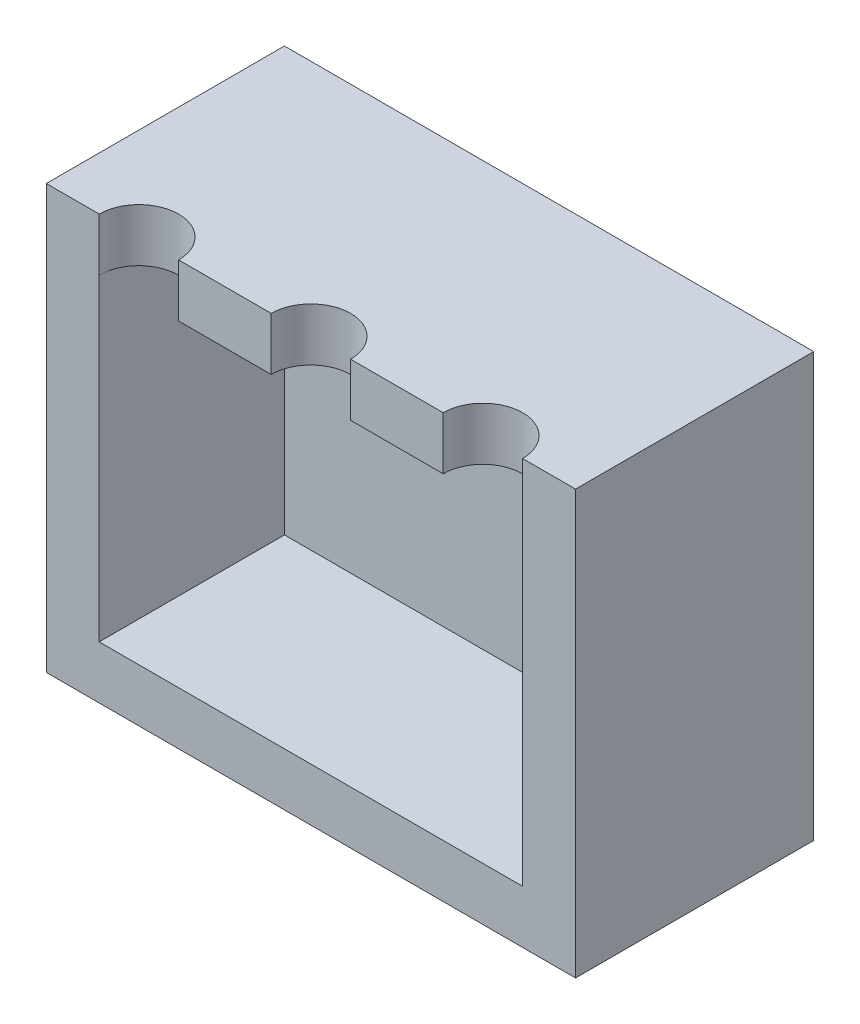
ISO-10303-21;
HEADER;
FILE_DESCRIPTION(('STEP AP214'),'2;1');
FILE_NAME('part.step','',(''),(''),'','','');
FILE_SCHEMA(('AUTOMOTIVE_DESIGN { 1 0 10303 214 1 1 1 1 }'));
ENDSEC;
DATA;
#1=APPLICATION_CONTEXT('core data for automotive mechanical design processes');
#2=APPLICATION_PROTOCOL_DEFINITION('international standard','automotive_design',2000,#1);
#3=PRODUCT_CONTEXT('',#1,'mechanical');
#4=PRODUCT('Part','Part','',(#3));
#5=PRODUCT_RELATED_PRODUCT_CATEGORY('part','',(#4));
#6=PRODUCT_DEFINITION_FORMATION('','',#4);
#7=PRODUCT_DEFINITION_CONTEXT('part definition',#1,'design');
#8=PRODUCT_DEFINITION('design','',#6,#7);
#9=PRODUCT_DEFINITION_SHAPE('','',#8);
#10=(LENGTH_UNIT() NAMED_UNIT(*) SI_UNIT(.MILLI.,.METRE.));
#11=(NAMED_UNIT(*) PLANE_ANGLE_UNIT() SI_UNIT($,.RADIAN.));
#12=(NAMED_UNIT(*) SI_UNIT($,.STERADIAN.) SOLID_ANGLE_UNIT());
#13=UNCERTAINTY_MEASURE_WITH_UNIT(LENGTH_MEASURE(1.E-05),#10,'distance_accuracy_value','');
#14=(GEOMETRIC_REPRESENTATION_CONTEXT(3) GLOBAL_UNCERTAINTY_ASSIGNED_CONTEXT((#13)) GLOBAL_UNIT_ASSIGNED_CONTEXT((#10,
#11,#12)) REPRESENTATION_CONTEXT('',''));
#15=CARTESIAN_POINT('',(0.,0.,0.));
#16=DIRECTION('',(0.,0.,1.));
#17=DIRECTION('',(1.,0.,0.));
#18=AXIS2_PLACEMENT_3D('',#15,#16,#17);
#19=CARTESIAN_POINT('',(0.,0.,9.));
#20=DIRECTION('',(0.,0.,-1.));
#21=DIRECTION('',(-1.,0.,0.));
#22=AXIS2_PLACEMENT_3D('',#19,#20,#21);
#23=PLANE('',#22);
#24=DIRECTION('',(0.,-1.,0.));
#25=VECTOR('',#24,1.);
#26=CARTESIAN_POINT('',(2.,14.,9.));
#27=LINE('',#26,#25);
#28=CARTESIAN_POINT('',(2.,14.,9.));
#29=VERTEX_POINT('',#28);
#30=CARTESIAN_POINT('',(2.,2.,9.));
#31=VERTEX_POINT('',#30);
#32=EDGE_CURVE('E193',#29,#31,#27,.T.);
#33=ORIENTED_EDGE('',*,*,#32,.F.);
#34=DIRECTION('',(0.,1.,0.));
#35=VECTOR('',#34,1.);
#36=CARTESIAN_POINT('',(2.,9.,9.));
#37=LINE('',#36,#35);
#38=CARTESIAN_POINT('',(2.,16.,9.));
#39=VERTEX_POINT('',#38);
#40=EDGE_CURVE('E195',#29,#39,#37,.T.);
#41=ORIENTED_EDGE('',*,*,#40,.T.);
#42=DIRECTION('',(-1.,0.,0.));
#43=VECTOR('',#42,1.);
#44=CARTESIAN_POINT('',(0.,16.,9.));
#45=LINE('',#44,#43);
#46=CARTESIAN_POINT('',(0.,16.,9.));
#47=VERTEX_POINT('',#46);
#48=EDGE_CURVE('E155',#39,#47,#45,.T.);
#49=ORIENTED_EDGE('',*,*,#48,.T.);
#50=DIRECTION('',(0.,-1.,0.));
#51=VECTOR('',#50,1.);
#52=CARTESIAN_POINT('',(0.,0.,9.));
#53=LINE('',#52,#51);
#54=CARTESIAN_POINT('',(0.,0.,9.));
#55=VERTEX_POINT('',#54);
#56=EDGE_CURVE('E167',#47,#55,#53,.T.);
#57=ORIENTED_EDGE('',*,*,#56,.T.);
#58=DIRECTION('',(1.,0.,0.));
#59=VECTOR('',#58,1.);
#60=CARTESIAN_POINT('',(0.,0.,9.));
#61=LINE('',#60,#59);
#62=CARTESIAN_POINT('',(20.,0.,9.));
#63=VERTEX_POINT('',#62);
#64=EDGE_CURVE('E166',#55,#63,#61,.T.);
#65=ORIENTED_EDGE('',*,*,#64,.T.);
#66=DIRECTION('',(0.,1.,0.));
#67=VECTOR('',#66,1.);
#68=CARTESIAN_POINT('',(20.,0.,9.));
#69=LINE('',#68,#67);
#70=CARTESIAN_POINT('',(20.,16.,9.));
#71=VERTEX_POINT('',#70);
#72=EDGE_CURVE('E151',#63,#71,#69,.T.);
#73=ORIENTED_EDGE('',*,*,#72,.T.);
#74=CARTESIAN_POINT('',(18.,16.,9.));
#75=VERTEX_POINT('',#74);
#76=EDGE_CURVE('E143',#71,#75,#45,.T.);
#77=ORIENTED_EDGE('',*,*,#76,.T.);
#78=DIRECTION('',(0.,1.,0.));
#79=VECTOR('',#78,1.);
#80=CARTESIAN_POINT('',(18.,9.,9.));
#81=LINE('',#80,#79);
#82=CARTESIAN_POINT('',(18.,14.,9.));
#83=VERTEX_POINT('',#82);
#84=EDGE_CURVE('E127',#75,#83,#81,.F.);
#85=ORIENTED_EDGE('',*,*,#84,.T.);
#86=DIRECTION('',(0.,1.,0.));
#87=VECTOR('',#86,1.);
#88=CARTESIAN_POINT('',(18.,14.,9.));
#89=LINE('',#88,#87);
#90=CARTESIAN_POINT('',(18.,2.,9.));
#91=VERTEX_POINT('',#90);
#92=EDGE_CURVE('E188',#91,#83,#89,.T.);
#93=ORIENTED_EDGE('',*,*,#92,.F.);
#94=DIRECTION('',(1.,0.,0.));
#95=VECTOR('',#94,1.);
#96=CARTESIAN_POINT('',(2.,2.,9.));
#97=LINE('',#96,#95);
#98=EDGE_CURVE('E190',#31,#91,#97,.T.);
#99=ORIENTED_EDGE('',*,*,#98,.F.);
#100=EDGE_LOOP('',(#33,#41,#49,#57,#65,#73,#77,#85,#93,#99));
#101=FACE_BOUND('',#100,.T.);
#102=ADVANCED_FACE('F33',(#101),#23,.F.);
#103=CARTESIAN_POINT('',(8.49999999999999,16.,9.));
#104=VERTEX_POINT('',#103);
#105=CARTESIAN_POINT('',(5.,16.,9.));
#106=VERTEX_POINT('',#105);
#107=EDGE_CURVE('E159',#104,#106,#45,.T.);
#108=ORIENTED_EDGE('',*,*,#107,.T.);
#109=DIRECTION('',(0.,1.,0.));
#110=VECTOR('',#109,1.);
#111=CARTESIAN_POINT('',(5.,9.,9.));
#112=LINE('',#111,#110);
#113=CARTESIAN_POINT('',(5.,14.,9.));
#114=VERTEX_POINT('',#113);
#115=EDGE_CURVE('E208',#106,#114,#112,.F.);
#116=ORIENTED_EDGE('',*,*,#115,.T.);
#117=DIRECTION('',(-1.,0.,0.));
#118=VECTOR('',#117,1.);
#119=CARTESIAN_POINT('',(2.,14.,9.));
#120=LINE('',#119,#118);
#121=CARTESIAN_POINT('',(8.49999999999999,14.,9.));
#122=VERTEX_POINT('',#121);
#123=EDGE_CURVE('E184',#122,#114,#120,.T.);
#124=ORIENTED_EDGE('',*,*,#123,.F.);
#125=DIRECTION('',(0.,1.,0.));
#126=VECTOR('',#125,1.);
#127=CARTESIAN_POINT('',(8.49999999999999,9.,9.));
#128=LINE('',#127,#126);
#129=EDGE_CURVE('E48',#122,#104,#128,.T.);
#130=ORIENTED_EDGE('',*,*,#129,.T.);
#131=EDGE_LOOP('',(#108,#116,#124,#130));
#132=FACE_BOUND('',#131,.T.);
#133=ADVANCED_FACE('F252',(#132),#23,.F.);
#134=CARTESIAN_POINT('',(0.,0.,9.));
#135=DIRECTION('',(1.,0.,0.));
#136=DIRECTION('',(0.,1.,0.));
#137=AXIS2_PLACEMENT_3D('',#134,#135,#136);
#138=PLANE('',#137);
#139=DIRECTION('',(0.,-1.,0.));
#140=VECTOR('',#139,1.);
#141=CARTESIAN_POINT('',(0.,0.,0.));
#142=LINE('',#141,#140);
#143=CARTESIAN_POINT('',(0.,16.,0.));
#144=VERTEX_POINT('',#143);
#145=CARTESIAN_POINT('',(0.,0.,0.));
#146=VERTEX_POINT('',#145);
#147=EDGE_CURVE('E183',#144,#146,#142,.T.);
#148=ORIENTED_EDGE('',*,*,#147,.T.);
#149=DIRECTION('',(0.,0.,-1.));
#150=VECTOR('',#149,1.);
#151=CARTESIAN_POINT('',(0.,0.,9.));
#152=LINE('',#151,#150);
#153=EDGE_CURVE('E231',#55,#146,#152,.T.);
#154=ORIENTED_EDGE('',*,*,#153,.F.);
#155=ORIENTED_EDGE('',*,*,#56,.F.);
#156=DIRECTION('',(0.,0.,-1.));
#157=VECTOR('',#156,1.);
#158=CARTESIAN_POINT('',(0.,16.,9.));
#159=LINE('',#158,#157);
#160=EDGE_CURVE('E153',#47,#144,#159,.T.);
#161=ORIENTED_EDGE('',*,*,#160,.T.);
#162=EDGE_LOOP('',(#148,#154,#155,#161));
#163=FACE_BOUND('',#162,.T.);
#164=ADVANCED_FACE('F35',(#163),#138,.F.);
#165=CARTESIAN_POINT('',(0.,0.,9.));
#166=DIRECTION('',(0.,1.,0.));
#167=DIRECTION('',(0.,0.,1.));
#168=AXIS2_PLACEMENT_3D('',#165,#166,#167);
#169=PLANE('',#168);
#170=DIRECTION('',(1.,0.,0.));
#171=VECTOR('',#170,1.);
#172=CARTESIAN_POINT('',(0.,0.,0.));
#173=LINE('',#172,#171);
#174=CARTESIAN_POINT('',(20.,0.,0.));
#175=VERTEX_POINT('',#174);
#176=EDGE_CURVE('E237',#146,#175,#173,.T.);
#177=ORIENTED_EDGE('',*,*,#176,.T.);
#178=DIRECTION('',(0.,0.,-1.));
#179=VECTOR('',#178,1.);
#180=CARTESIAN_POINT('',(20.,0.,9.));
#181=LINE('',#180,#179);
#182=EDGE_CURVE('E235',#63,#175,#181,.T.);
#183=ORIENTED_EDGE('',*,*,#182,.F.);
#184=ORIENTED_EDGE('',*,*,#64,.F.);
#185=ORIENTED_EDGE('',*,*,#153,.T.);
#186=EDGE_LOOP('',(#177,#183,#184,#185));
#187=FACE_BOUND('',#186,.T.);
#188=ADVANCED_FACE('F236',(#187),#169,.F.);
#189=CARTESIAN_POINT('',(20.,0.,9.));
#190=DIRECTION('',(-1.,0.,0.));
#191=DIRECTION('',(0.,-1.,0.));
#192=AXIS2_PLACEMENT_3D('',#189,#190,#191);
#193=PLANE('',#192);
#194=DIRECTION('',(0.,1.,0.));
#195=VECTOR('',#194,1.);
#196=CARTESIAN_POINT('',(20.,0.,0.));
#197=LINE('',#196,#195);
#198=CARTESIAN_POINT('',(20.,16.,0.));
#199=VERTEX_POINT('',#198);
#200=EDGE_CURVE('E242',#175,#199,#197,.T.);
#201=ORIENTED_EDGE('',*,*,#200,.T.);
#202=DIRECTION('',(0.,0.,-1.));
#203=VECTOR('',#202,1.);
#204=CARTESIAN_POINT('',(20.,16.,9.));
#205=LINE('',#204,#203);
#206=EDGE_CURVE('E157',#71,#199,#205,.T.);
#207=ORIENTED_EDGE('',*,*,#206,.F.);
#208=ORIENTED_EDGE('',*,*,#72,.F.);
#209=ORIENTED_EDGE('',*,*,#182,.T.);
#210=EDGE_LOOP('',(#201,#207,#208,#209));
#211=FACE_BOUND('',#210,.T.);
#212=ADVANCED_FACE('F241',(#211),#193,.F.);
#213=CARTESIAN_POINT('',(0.,16.,9.));
#214=DIRECTION('',(0.,-1.,0.));
#215=DIRECTION('',(0.,0.,-1.));
#216=AXIS2_PLACEMENT_3D('',#213,#214,#215);
#217=PLANE('',#216);
#218=ORIENTED_EDGE('',*,*,#48,.F.);
#219=CARTESIAN_POINT('',(3.5,16.,9.));
#220=DIRECTION('',(0.,1.,0.));
#221=DIRECTION('',(0.,0.,1.));
#222=AXIS2_PLACEMENT_3D('',#219,#220,#221);
#223=CIRCLE('',#222,1.5);
#224=EDGE_CURVE('E216',#106,#39,#223,.T.);
#225=ORIENTED_EDGE('',*,*,#224,.F.);
#226=ORIENTED_EDGE('',*,*,#107,.F.);
#227=CARTESIAN_POINT('',(10.,16.,9.));
#228=DIRECTION('',(0.,1.,0.));
#229=DIRECTION('',(0.,0.,1.));
#230=AXIS2_PLACEMENT_3D('',#227,#228,#229);
#231=CIRCLE('',#230,1.5);
#232=CARTESIAN_POINT('',(11.5,16.,9.));
#233=VERTEX_POINT('',#232);
#234=EDGE_CURVE('E147',#233,#104,#231,.T.);
#235=ORIENTED_EDGE('',*,*,#234,.F.);
#236=CARTESIAN_POINT('',(15.,16.,9.));
#237=VERTEX_POINT('',#236);
#238=EDGE_CURVE('E146',#237,#233,#45,.T.);
#239=ORIENTED_EDGE('',*,*,#238,.F.);
#240=CARTESIAN_POINT('',(16.5,16.,9.));
#241=DIRECTION('',(0.,1.,0.));
#242=DIRECTION('',(0.,0.,1.));
#243=AXIS2_PLACEMENT_3D('',#240,#241,#242);
#244=CIRCLE('',#243,1.5);
#245=EDGE_CURVE('E130',#75,#237,#244,.T.);
#246=ORIENTED_EDGE('',*,*,#245,.F.);
#247=ORIENTED_EDGE('',*,*,#76,.F.);
#248=ORIENTED_EDGE('',*,*,#206,.T.);
#249=DIRECTION('',(-1.,0.,0.));
#250=VECTOR('',#249,1.);
#251=CARTESIAN_POINT('',(0.,16.,0.));
#252=LINE('',#251,#250);
#253=EDGE_CURVE('E171',#199,#144,#252,.T.);
#254=ORIENTED_EDGE('',*,*,#253,.T.);
#255=ORIENTED_EDGE('',*,*,#160,.F.);
#256=EDGE_LOOP('',(#218,#225,#226,#235,#239,#246,#247,#248,#254,#255));
#257=FACE_BOUND('',#256,.T.);
#258=ADVANCED_FACE('F141',(#257),#217,.F.);
#259=ORIENTED_EDGE('',*,*,#238,.T.);
#260=DIRECTION('',(0.,1.,0.));
#261=VECTOR('',#260,1.);
#262=CARTESIAN_POINT('',(11.5,9.,9.));
#263=LINE('',#262,#261);
#264=CARTESIAN_POINT('',(11.5,14.,9.));
#265=VERTEX_POINT('',#264);
#266=EDGE_CURVE('E212',#233,#265,#263,.F.);
#267=ORIENTED_EDGE('',*,*,#266,.T.);
#268=CARTESIAN_POINT('',(15.,14.,9.));
#269=VERTEX_POINT('',#268);
#270=EDGE_CURVE('E187',#269,#265,#120,.T.);
#271=ORIENTED_EDGE('',*,*,#270,.F.);
#272=DIRECTION('',(0.,1.,0.));
#273=VECTOR('',#272,1.);
#274=CARTESIAN_POINT('',(15.,9.,9.));
#275=LINE('',#274,#273);
#276=EDGE_CURVE('E56',#269,#237,#275,.T.);
#277=ORIENTED_EDGE('',*,*,#276,.T.);
#278=EDGE_LOOP('',(#259,#267,#271,#277));
#279=FACE_BOUND('',#278,.T.);
#280=ADVANCED_FACE('F254',(#279),#23,.F.);
#281=CARTESIAN_POINT('',(0.,0.,0.));
#282=DIRECTION('',(0.,0.,-1.));
#283=DIRECTION('',(-1.,0.,0.));
#284=AXIS2_PLACEMENT_3D('',#281,#282,#283);
#285=PLANE('',#284);
#286=ORIENTED_EDGE('',*,*,#147,.F.);
#287=ORIENTED_EDGE('',*,*,#253,.F.);
#288=ORIENTED_EDGE('',*,*,#200,.F.);
#289=ORIENTED_EDGE('',*,*,#176,.F.);
#290=EDGE_LOOP('',(#286,#287,#288,#289));
#291=FACE_BOUND('',#290,.T.);
#292=ADVANCED_FACE('F273',(#291),#285,.T.);
#293=CARTESIAN_POINT('',(2.,14.,2.));
#294=DIRECTION('',(-1.,0.,0.));
#295=DIRECTION('',(0.,-1.,0.));
#296=AXIS2_PLACEMENT_3D('',#293,#294,#295);
#297=PLANE('',#296);
#298=ORIENTED_EDGE('',*,*,#32,.T.);
#299=DIRECTION('',(0.,0.,1.));
#300=VECTOR('',#299,1.);
#301=CARTESIAN_POINT('',(2.,2.,2.));
#302=LINE('',#301,#300);
#303=CARTESIAN_POINT('',(2.,2.,2.));
#304=VERTEX_POINT('',#303);
#305=EDGE_CURVE('E172',#304,#31,#302,.T.);
#306=ORIENTED_EDGE('',*,*,#305,.F.);
#307=DIRECTION('',(0.,-1.,0.));
#308=VECTOR('',#307,1.);
#309=CARTESIAN_POINT('',(2.,14.,2.));
#310=LINE('',#309,#308);
#311=CARTESIAN_POINT('',(2.,14.,2.));
#312=VERTEX_POINT('',#311);
#313=EDGE_CURVE('E204',#312,#304,#310,.T.);
#314=ORIENTED_EDGE('',*,*,#313,.F.);
#315=DIRECTION('',(0.,0.,1.));
#316=VECTOR('',#315,1.);
#317=CARTESIAN_POINT('',(2.,14.,2.));
#318=LINE('',#317,#316);
#319=EDGE_CURVE('E180',#312,#29,#318,.T.);
#320=ORIENTED_EDGE('',*,*,#319,.T.);
#321=EDGE_LOOP('',(#298,#306,#314,#320));
#322=FACE_BOUND('',#321,.T.);
#323=ADVANCED_FACE('F278',(#322),#297,.F.);
#324=CARTESIAN_POINT('',(2.,14.,2.));
#325=DIRECTION('',(0.,1.,0.));
#326=DIRECTION('',(0.,0.,1.));
#327=AXIS2_PLACEMENT_3D('',#324,#325,#326);
#328=PLANE('',#327);
#329=ORIENTED_EDGE('',*,*,#123,.T.);
#330=CARTESIAN_POINT('',(3.5,14.,9.));
#331=DIRECTION('',(0.,1.,0.));
#332=DIRECTION('',(0.,0.,1.));
#333=AXIS2_PLACEMENT_3D('',#330,#331,#332);
#334=CIRCLE('',#333,1.5);
#335=EDGE_CURVE('E11',#114,#29,#334,.T.);
#336=ORIENTED_EDGE('',*,*,#335,.T.);
#337=ORIENTED_EDGE('',*,*,#319,.F.);
#338=DIRECTION('',(-1.,0.,0.));
#339=VECTOR('',#338,1.);
#340=CARTESIAN_POINT('',(2.,14.,2.));
#341=LINE('',#340,#339);
#342=CARTESIAN_POINT('',(18.,14.,2.));
#343=VERTEX_POINT('',#342);
#344=EDGE_CURVE('E176',#343,#312,#341,.T.);
#345=ORIENTED_EDGE('',*,*,#344,.F.);
#346=DIRECTION('',(0.,0.,1.));
#347=VECTOR('',#346,1.);
#348=CARTESIAN_POINT('',(18.,14.,2.));
#349=LINE('',#348,#347);
#350=EDGE_CURVE('E178',#343,#83,#349,.T.);
#351=ORIENTED_EDGE('',*,*,#350,.T.);
#352=CARTESIAN_POINT('',(16.5,14.,9.));
#353=DIRECTION('',(0.,1.,0.));
#354=DIRECTION('',(0.,0.,1.));
#355=AXIS2_PLACEMENT_3D('',#352,#353,#354);
#356=CIRCLE('',#355,1.5);
#357=EDGE_CURVE('E131',#83,#269,#356,.T.);
#358=ORIENTED_EDGE('',*,*,#357,.T.);
#359=ORIENTED_EDGE('',*,*,#270,.T.);
#360=CARTESIAN_POINT('',(10.,14.,9.));
#361=DIRECTION('',(0.,1.,0.));
#362=DIRECTION('',(0.,0.,1.));
#363=AXIS2_PLACEMENT_3D('',#360,#361,#362);
#364=CIRCLE('',#363,1.5);
#365=EDGE_CURVE('E41',#265,#122,#364,.T.);
#366=ORIENTED_EDGE('',*,*,#365,.T.);
#367=EDGE_LOOP('',(#329,#336,#337,#345,#351,#358,#359,#366));
#368=FACE_BOUND('',#367,.T.);
#369=ADVANCED_FACE('F249',(#368),#328,.F.);
#370=CARTESIAN_POINT('',(18.,14.,2.));
#371=DIRECTION('',(1.,0.,0.));
#372=DIRECTION('',(0.,0.,-1.));
#373=AXIS2_PLACEMENT_3D('',#370,#371,#372);
#374=PLANE('',#373);
#375=ORIENTED_EDGE('',*,*,#92,.T.);
#376=ORIENTED_EDGE('',*,*,#350,.F.);
#377=DIRECTION('',(0.,1.,0.));
#378=VECTOR('',#377,1.);
#379=CARTESIAN_POINT('',(18.,14.,2.));
#380=LINE('',#379,#378);
#381=CARTESIAN_POINT('',(18.,2.,2.));
#382=VERTEX_POINT('',#381);
#383=EDGE_CURVE('E198',#382,#343,#380,.T.);
#384=ORIENTED_EDGE('',*,*,#383,.F.);
#385=DIRECTION('',(0.,0.,1.));
#386=VECTOR('',#385,1.);
#387=CARTESIAN_POINT('',(18.,2.,2.));
#388=LINE('',#387,#386);
#389=EDGE_CURVE('E175',#382,#91,#388,.T.);
#390=ORIENTED_EDGE('',*,*,#389,.T.);
#391=EDGE_LOOP('',(#375,#376,#384,#390));
#392=FACE_BOUND('',#391,.T.);
#393=ADVANCED_FACE('F326',(#392),#374,.F.);
#394=CARTESIAN_POINT('',(2.,2.,2.));
#395=DIRECTION('',(0.,-1.,0.));
#396=DIRECTION('',(0.,0.,-1.));
#397=AXIS2_PLACEMENT_3D('',#394,#395,#396);
#398=PLANE('',#397);
#399=ORIENTED_EDGE('',*,*,#98,.T.);
#400=ORIENTED_EDGE('',*,*,#389,.F.);
#401=DIRECTION('',(1.,0.,0.));
#402=VECTOR('',#401,1.);
#403=CARTESIAN_POINT('',(2.,2.,2.));
#404=LINE('',#403,#402);
#405=EDGE_CURVE('E201',#304,#382,#404,.T.);
#406=ORIENTED_EDGE('',*,*,#405,.F.);
#407=ORIENTED_EDGE('',*,*,#305,.T.);
#408=EDGE_LOOP('',(#399,#400,#406,#407));
#409=FACE_BOUND('',#408,.T.);
#410=ADVANCED_FACE('F335',(#409),#398,.F.);
#411=CARTESIAN_POINT('',(0.,0.,2.));
#412=DIRECTION('',(0.,0.,1.));
#413=DIRECTION('',(1.,0.,0.));
#414=AXIS2_PLACEMENT_3D('',#411,#412,#413);
#415=PLANE('',#414);
#416=ORIENTED_EDGE('',*,*,#313,.T.);
#417=ORIENTED_EDGE('',*,*,#405,.T.);
#418=ORIENTED_EDGE('',*,*,#383,.T.);
#419=ORIENTED_EDGE('',*,*,#344,.T.);
#420=EDGE_LOOP('',(#416,#417,#418,#419));
#421=FACE_BOUND('',#420,.T.);
#422=ADVANCED_FACE('F263',(#421),#415,.T.);
#423=CARTESIAN_POINT('',(16.5,9.,9.));
#424=DIRECTION('',(0.,1.,0.));
#425=DIRECTION('',(0.,0.,1.));
#426=AXIS2_PLACEMENT_3D('',#423,#424,#425);
#427=CYLINDRICAL_SURFACE('',#426,1.5);
#428=ORIENTED_EDGE('',*,*,#357,.F.);
#429=ORIENTED_EDGE('',*,*,#84,.F.);
#430=ORIENTED_EDGE('',*,*,#245,.T.);
#431=ORIENTED_EDGE('',*,*,#276,.F.);
#432=EDGE_LOOP('',(#428,#429,#430,#431));
#433=FACE_BOUND('',#432,.T.);
#434=ADVANCED_FACE('F129',(#433),#427,.F.);
#435=CARTESIAN_POINT('',(10.,9.,9.));
#436=DIRECTION('',(0.,1.,0.));
#437=DIRECTION('',(0.,0.,1.));
#438=AXIS2_PLACEMENT_3D('',#435,#436,#437);
#439=CYLINDRICAL_SURFACE('',#438,1.5);
#440=ORIENTED_EDGE('',*,*,#365,.F.);
#441=ORIENTED_EDGE('',*,*,#266,.F.);
#442=ORIENTED_EDGE('',*,*,#234,.T.);
#443=ORIENTED_EDGE('',*,*,#129,.F.);
#444=EDGE_LOOP('',(#440,#441,#442,#443));
#445=FACE_BOUND('',#444,.T.);
#446=ADVANCED_FACE('F255',(#445),#439,.F.);
#447=CARTESIAN_POINT('',(3.5,9.,9.));
#448=DIRECTION('',(0.,1.,0.));
#449=DIRECTION('',(0.,0.,1.));
#450=AXIS2_PLACEMENT_3D('',#447,#448,#449);
#451=CYLINDRICAL_SURFACE('',#450,1.5);
#452=ORIENTED_EDGE('',*,*,#335,.F.);
#453=ORIENTED_EDGE('',*,*,#115,.F.);
#454=ORIENTED_EDGE('',*,*,#224,.T.);
#455=ORIENTED_EDGE('',*,*,#40,.F.);
#456=EDGE_LOOP('',(#452,#453,#454,#455));
#457=FACE_BOUND('',#456,.T.);
#458=ADVANCED_FACE('F221',(#457),#451,.F.);
#459=CLOSED_SHELL('',(#102,#133,#164,#188,#212,#258,#280,#292,#323,#369,#393,#410,#422,#434,
#446,#458));
#460=MANIFOLD_SOLID_BREP('B2',#459);
#461=ADVANCED_BREP_SHAPE_REPRESENTATION('',(#18,#460),#14);
#462=SHAPE_DEFINITION_REPRESENTATION(#9,#461);
ENDSEC;
END-ISO-10303-21;
